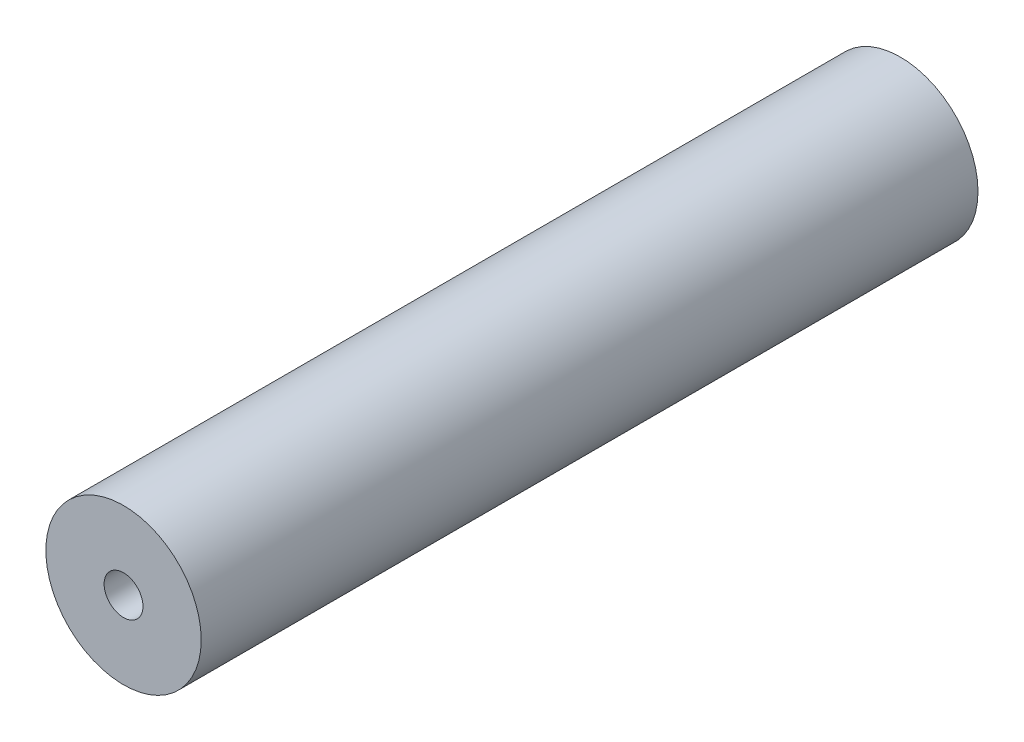
ISO-10303-21;
HEADER;
FILE_DESCRIPTION(('STEP AP214'),'2;1');
FILE_NAME('part.step','',(''),(''),'','','');
FILE_SCHEMA(('AUTOMOTIVE_DESIGN { 1 0 10303 214 1 1 1 1 }'));
ENDSEC;
DATA;
#1=APPLICATION_CONTEXT('core data for automotive mechanical design processes');
#2=APPLICATION_PROTOCOL_DEFINITION('international standard','automotive_design',2000,#1);
#3=PRODUCT_CONTEXT('',#1,'mechanical');
#4=PRODUCT('Part','Part','',(#3));
#5=PRODUCT_RELATED_PRODUCT_CATEGORY('part','',(#4));
#6=PRODUCT_DEFINITION_FORMATION('','',#4);
#7=PRODUCT_DEFINITION_CONTEXT('part definition',#1,'design');
#8=PRODUCT_DEFINITION('design','',#6,#7);
#9=PRODUCT_DEFINITION_SHAPE('','',#8);
#10=(LENGTH_UNIT() NAMED_UNIT(*) SI_UNIT(.MILLI.,.METRE.));
#11=(NAMED_UNIT(*) PLANE_ANGLE_UNIT() SI_UNIT($,.RADIAN.));
#12=(NAMED_UNIT(*) SI_UNIT($,.STERADIAN.) SOLID_ANGLE_UNIT());
#13=UNCERTAINTY_MEASURE_WITH_UNIT(LENGTH_MEASURE(1.E-05),#10,'distance_accuracy_value','');
#14=(GEOMETRIC_REPRESENTATION_CONTEXT(3) GLOBAL_UNCERTAINTY_ASSIGNED_CONTEXT((#13)) GLOBAL_UNIT_ASSIGNED_CONTEXT((#10,
#11,#12)) REPRESENTATION_CONTEXT('',''));
#15=CARTESIAN_POINT('',(0.,0.,0.));
#16=DIRECTION('',(0.,0.,1.));
#17=DIRECTION('',(1.,0.,0.));
#18=AXIS2_PLACEMENT_3D('',#15,#16,#17);
#19=CARTESIAN_POINT('',(0.,0.,254.));
#20=DIRECTION('',(0.,0.,-1.));
#21=DIRECTION('',(-1.,0.,0.));
#22=AXIS2_PLACEMENT_3D('',#19,#20,#21);
#23=CYLINDRICAL_SURFACE('',#22,25.4);
#24=CARTESIAN_POINT('',(0.,0.,254.));
#25=DIRECTION('',(0.,0.,1.));
#26=DIRECTION('',(1.,0.,0.));
#27=AXIS2_PLACEMENT_3D('',#24,#25,#26);
#28=CIRCLE('',#27,25.4);
#29=CARTESIAN_POINT('',(25.4,0.,254.));
#30=VERTEX_POINT('',#29);
#31=EDGE_CURVE('E10',#30,#30,#28,.T.);
#32=ORIENTED_EDGE('',*,*,#31,.F.);
#33=EDGE_LOOP('',(#32));
#34=FACE_BOUND('',#33,.T.);
#35=CARTESIAN_POINT('',(0.,0.,0.));
#36=DIRECTION('',(0.,0.,1.));
#37=DIRECTION('',(1.,0.,0.));
#38=AXIS2_PLACEMENT_3D('',#35,#36,#37);
#39=CIRCLE('',#38,25.4);
#40=CARTESIAN_POINT('',(25.4,0.,0.));
#41=VERTEX_POINT('',#40);
#42=EDGE_CURVE('E34',#41,#41,#39,.T.);
#43=ORIENTED_EDGE('',*,*,#42,.T.);
#44=EDGE_LOOP('',(#43));
#45=FACE_BOUND('',#44,.T.);
#46=ADVANCED_FACE('F31',(#34,#45),#23,.T.);
#47=CARTESIAN_POINT('',(0.,0.,254.));
#48=DIRECTION('',(0.,0.,1.));
#49=DIRECTION('',(1.,0.,0.));
#50=AXIS2_PLACEMENT_3D('',#47,#48,#49);
#51=PLANE('',#50);
#52=CARTESIAN_POINT('',(0.,0.,254.));
#53=DIRECTION('',(0.,0.,1.));
#54=DIRECTION('',(1.,0.,0.));
#55=AXIS2_PLACEMENT_3D('',#52,#53,#54);
#56=CIRCLE('',#55,6.35);
#57=CARTESIAN_POINT('',(6.35,0.,254.));
#58=VERTEX_POINT('',#57);
#59=EDGE_CURVE('E43',#58,#58,#56,.T.);
#60=ORIENTED_EDGE('',*,*,#59,.F.);
#61=EDGE_LOOP('',(#60));
#62=FACE_BOUND('',#61,.T.);
#63=ORIENTED_EDGE('',*,*,#31,.T.);
#64=EDGE_LOOP('',(#63));
#65=FACE_BOUND('',#64,.T.);
#66=ADVANCED_FACE('F58',(#62,#65),#51,.T.);
#67=CARTESIAN_POINT('',(0.,0.,0.));
#68=DIRECTION('',(0.,0.,1.));
#69=DIRECTION('',(1.,0.,0.));
#70=AXIS2_PLACEMENT_3D('',#67,#68,#69);
#71=PLANE('',#70);
#72=CARTESIAN_POINT('',(0.,0.,0.));
#73=DIRECTION('',(0.,0.,1.));
#74=DIRECTION('',(1.,0.,0.));
#75=AXIS2_PLACEMENT_3D('',#72,#73,#74);
#76=CIRCLE('',#75,6.35);
#77=CARTESIAN_POINT('',(6.35,0.,0.));
#78=VERTEX_POINT('',#77);
#79=EDGE_CURVE('E41',#78,#78,#76,.T.);
#80=ORIENTED_EDGE('',*,*,#79,.T.);
#81=EDGE_LOOP('',(#80));
#82=FACE_BOUND('',#81,.T.);
#83=ORIENTED_EDGE('',*,*,#42,.F.);
#84=EDGE_LOOP('',(#83));
#85=FACE_BOUND('',#84,.T.);
#86=ADVANCED_FACE('F49',(#82,#85),#71,.F.);
#87=CARTESIAN_POINT('',(0.,0.,0.));
#88=DIRECTION('',(0.,0.,1.));
#89=DIRECTION('',(1.,0.,0.));
#90=AXIS2_PLACEMENT_3D('',#87,#88,#89);
#91=CYLINDRICAL_SURFACE('',#90,6.35);
#92=ORIENTED_EDGE('',*,*,#79,.F.);
#93=EDGE_LOOP('',(#92));
#94=FACE_BOUND('',#93,.T.);
#95=ORIENTED_EDGE('',*,*,#59,.T.);
#96=EDGE_LOOP('',(#95));
#97=FACE_BOUND('',#96,.T.);
#98=ADVANCED_FACE('F52',(#94,#97),#91,.F.);
#99=CLOSED_SHELL('',(#46,#66,#86,#98));
#100=MANIFOLD_SOLID_BREP('B2',#99);
#101=ADVANCED_BREP_SHAPE_REPRESENTATION('',(#18,#100),#14);
#102=SHAPE_DEFINITION_REPRESENTATION(#9,#101);
ENDSEC;
END-ISO-10303-21;
